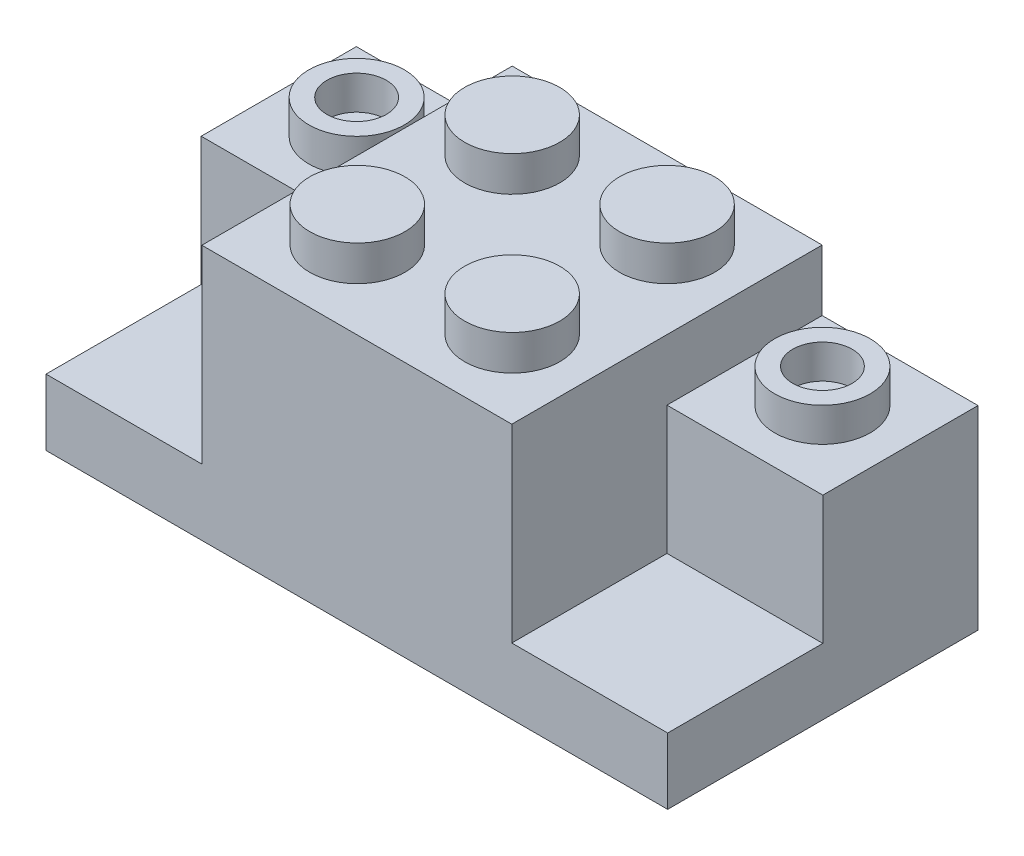
ISO-10303-21;
HEADER;
FILE_DESCRIPTION(('STEP AP214'),'2;1');
FILE_NAME('part.step','',(''),(''),'','','');
FILE_SCHEMA(('AUTOMOTIVE_DESIGN { 1 0 10303 214 1 1 1 1 }'));
ENDSEC;
DATA;
#1=APPLICATION_CONTEXT('core data for automotive mechanical design processes');
#2=APPLICATION_PROTOCOL_DEFINITION('international standard','automotive_design',2000,#1);
#3=PRODUCT_CONTEXT('',#1,'mechanical');
#4=PRODUCT('Part','Part','',(#3));
#5=PRODUCT_RELATED_PRODUCT_CATEGORY('part','',(#4));
#6=PRODUCT_DEFINITION_FORMATION('','',#4);
#7=PRODUCT_DEFINITION_CONTEXT('part definition',#1,'design');
#8=PRODUCT_DEFINITION('design','',#6,#7);
#9=PRODUCT_DEFINITION_SHAPE('','',#8);
#10=(LENGTH_UNIT() NAMED_UNIT(*) SI_UNIT(.MILLI.,.METRE.));
#11=(NAMED_UNIT(*) PLANE_ANGLE_UNIT() SI_UNIT($,.RADIAN.));
#12=(NAMED_UNIT(*) SI_UNIT($,.STERADIAN.) SOLID_ANGLE_UNIT());
#13=UNCERTAINTY_MEASURE_WITH_UNIT(LENGTH_MEASURE(1.E-05),#10,'distance_accuracy_value','');
#14=(GEOMETRIC_REPRESENTATION_CONTEXT(3) GLOBAL_UNCERTAINTY_ASSIGNED_CONTEXT((#13)) GLOBAL_UNIT_ASSIGNED_CONTEXT((#10,
#11,#12)) REPRESENTATION_CONTEXT('',''));
#15=CARTESIAN_POINT('',(0.,0.,0.));
#16=DIRECTION('',(0.,0.,1.));
#17=DIRECTION('',(1.,0.,0.));
#18=AXIS2_PLACEMENT_3D('',#15,#16,#17);
#19=CARTESIAN_POINT('',(7.965,9.74,-15.95));
#20=DIRECTION('',(1.,0.,0.));
#21=DIRECTION('',(0.,0.,-1.));
#22=AXIS2_PLACEMENT_3D('',#19,#20,#21);
#23=PLANE('',#22);
#24=DIRECTION('',(0.,0.,1.));
#25=VECTOR('',#24,1.);
#26=CARTESIAN_POINT('',(7.965,0.,-15.95));
#27=LINE('',#26,#25);
#28=CARTESIAN_POINT('',(7.965,0.,-7.975));
#29=VERTEX_POINT('',#28);
#30=CARTESIAN_POINT('',(7.965,0.,0.));
#31=VERTEX_POINT('',#30);
#32=EDGE_CURVE('E239',#29,#31,#27,.T.);
#33=ORIENTED_EDGE('',*,*,#32,.F.);
#34=DIRECTION('',(0.,-1.,0.));
#35=VECTOR('',#34,1.);
#36=CARTESIAN_POINT('',(7.965,21.0431289915669,-7.975));
#37=LINE('',#36,#35);
#38=CARTESIAN_POINT('',(7.965,6.6,-7.975));
#39=VERTEX_POINT('',#38);
#40=EDGE_CURVE('E50',#39,#29,#37,.T.);
#41=ORIENTED_EDGE('',*,*,#40,.F.);
#42=DIRECTION('',(0.,0.,1.));
#43=VECTOR('',#42,1.);
#44=CARTESIAN_POINT('',(7.965,6.6,-15.95));
#45=LINE('',#44,#43);
#46=CARTESIAN_POINT('',(7.965,6.6,-15.95));
#47=VERTEX_POINT('',#46);
#48=EDGE_CURVE('E143',#47,#39,#45,.T.);
#49=ORIENTED_EDGE('',*,*,#48,.F.);
#50=DIRECTION('',(0.,1.,0.));
#51=VECTOR('',#50,1.);
#52=CARTESIAN_POINT('',(7.965,9.74,-15.95));
#53=LINE('',#52,#51);
#54=CARTESIAN_POINT('',(7.965,9.74,-15.95));
#55=VERTEX_POINT('',#54);
#56=EDGE_CURVE('E207',#47,#55,#53,.T.);
#57=ORIENTED_EDGE('',*,*,#56,.T.);
#58=DIRECTION('',(0.,0.,1.));
#59=VECTOR('',#58,1.);
#60=CARTESIAN_POINT('',(7.965,9.74,-15.95));
#61=LINE('',#60,#59);
#62=CARTESIAN_POINT('',(7.965,9.74,0.));
#63=VERTEX_POINT('',#62);
#64=EDGE_CURVE('E237',#55,#63,#61,.T.);
#65=ORIENTED_EDGE('',*,*,#64,.T.);
#66=DIRECTION('',(0.,1.,0.));
#67=VECTOR('',#66,1.);
#68=CARTESIAN_POINT('',(7.965,9.74,0.));
#69=LINE('',#68,#67);
#70=EDGE_CURVE('E230',#31,#63,#69,.T.);
#71=ORIENTED_EDGE('',*,*,#70,.F.);
#72=EDGE_LOOP('',(#33,#41,#49,#57,#65,#71));
#73=FACE_BOUND('',#72,.T.);
#74=ADVANCED_FACE('F35',(#73),#23,.T.);
#75=CARTESIAN_POINT('',(7.965,0.,-15.95));
#76=DIRECTION('',(0.,1.,0.));
#77=DIRECTION('',(0.,0.,1.));
#78=AXIS2_PLACEMENT_3D('',#75,#76,#77);
#79=PLANE('',#78);
#80=DIRECTION('',(0.,0.,1.));
#81=VECTOR('',#80,1.);
#82=CARTESIAN_POINT('',(15.975,0.,-15.95));
#83=LINE('',#82,#81);
#84=CARTESIAN_POINT('',(15.975,0.,-7.975));
#85=VERTEX_POINT('',#84);
#86=CARTESIAN_POINT('',(15.975,0.,0.));
#87=VERTEX_POINT('',#86);
#88=EDGE_CURVE('E241',#85,#87,#83,.T.);
#89=ORIENTED_EDGE('',*,*,#88,.F.);
#90=DIRECTION('',(1.,0.,0.));
#91=VECTOR('',#90,1.);
#92=CARTESIAN_POINT('',(15.975,0.,-7.975));
#93=LINE('',#92,#91);
#94=EDGE_CURVE('E58',#29,#85,#93,.T.);
#95=ORIENTED_EDGE('',*,*,#94,.F.);
#96=ORIENTED_EDGE('',*,*,#32,.T.);
#97=DIRECTION('',(-1.,0.,0.));
#98=VECTOR('',#97,1.);
#99=CARTESIAN_POINT('',(7.965,0.,0.));
#100=LINE('',#99,#98);
#101=EDGE_CURVE('E227',#87,#31,#100,.T.);
#102=ORIENTED_EDGE('',*,*,#101,.F.);
#103=EDGE_LOOP('',(#89,#95,#96,#102));
#104=FACE_BOUND('',#103,.T.);
#105=ADVANCED_FACE('F276',(#104),#79,.T.);
#106=CARTESIAN_POINT('',(-7.965,0.,-15.95));
#107=DIRECTION('',(-1.,0.,0.));
#108=DIRECTION('',(0.,0.,1.));
#109=AXIS2_PLACEMENT_3D('',#106,#107,#108);
#110=PLANE('',#109);
#111=DIRECTION('',(0.,0.,-1.));
#112=VECTOR('',#111,1.);
#113=CARTESIAN_POINT('',(-7.965,6.6,-15.95));
#114=LINE('',#113,#112);
#115=CARTESIAN_POINT('',(-7.965,6.6,-7.975));
#116=VERTEX_POINT('',#115);
#117=CARTESIAN_POINT('',(-7.965,6.6,-15.95));
#118=VERTEX_POINT('',#117);
#119=EDGE_CURVE('E159',#116,#118,#114,.T.);
#120=ORIENTED_EDGE('',*,*,#119,.F.);
#121=DIRECTION('',(0.,-1.,0.));
#122=VECTOR('',#121,1.);
#123=CARTESIAN_POINT('',(-7.965,21.0431289915669,-7.975));
#124=LINE('',#123,#122);
#125=CARTESIAN_POINT('',(-7.965,0.,-7.975));
#126=VERTEX_POINT('',#125);
#127=EDGE_CURVE('E158',#116,#126,#124,.T.);
#128=ORIENTED_EDGE('',*,*,#127,.T.);
#129=DIRECTION('',(0.,0.,1.));
#130=VECTOR('',#129,1.);
#131=CARTESIAN_POINT('',(-7.965,0.,-15.95));
#132=LINE('',#131,#130);
#133=CARTESIAN_POINT('',(-7.965,0.,0.));
#134=VERTEX_POINT('',#133);
#135=EDGE_CURVE('E212',#126,#134,#132,.T.);
#136=ORIENTED_EDGE('',*,*,#135,.T.);
#137=DIRECTION('',(0.,-1.,0.));
#138=VECTOR('',#137,1.);
#139=CARTESIAN_POINT('',(-7.965,0.,0.));
#140=LINE('',#139,#138);
#141=CARTESIAN_POINT('',(-7.965,9.74,0.));
#142=VERTEX_POINT('',#141);
#143=EDGE_CURVE('E194',#142,#134,#140,.T.);
#144=ORIENTED_EDGE('',*,*,#143,.F.);
#145=DIRECTION('',(0.,0.,1.));
#146=VECTOR('',#145,1.);
#147=CARTESIAN_POINT('',(-7.965,9.74,-15.95));
#148=LINE('',#147,#146);
#149=CARTESIAN_POINT('',(-7.965,9.74,-15.95));
#150=VERTEX_POINT('',#149);
#151=EDGE_CURVE('E235',#150,#142,#148,.T.);
#152=ORIENTED_EDGE('',*,*,#151,.F.);
#153=DIRECTION('',(0.,-1.,0.));
#154=VECTOR('',#153,1.);
#155=CARTESIAN_POINT('',(-7.965,0.,-15.95));
#156=LINE('',#155,#154);
#157=EDGE_CURVE('E197',#150,#118,#156,.T.);
#158=ORIENTED_EDGE('',*,*,#157,.T.);
#159=EDGE_LOOP('',(#120,#128,#136,#144,#152,#158));
#160=FACE_BOUND('',#159,.T.);
#161=ADVANCED_FACE('F37',(#160),#110,.T.);
#162=CARTESIAN_POINT('',(-15.975,0.,-15.95));
#163=DIRECTION('',(0.,1.,0.));
#164=DIRECTION('',(0.,0.,1.));
#165=AXIS2_PLACEMENT_3D('',#162,#163,#164);
#166=PLANE('',#165);
#167=ORIENTED_EDGE('',*,*,#135,.F.);
#168=DIRECTION('',(1.,0.,0.));
#169=VECTOR('',#168,1.);
#170=CARTESIAN_POINT('',(-15.975,0.,-7.975));
#171=LINE('',#170,#169);
#172=CARTESIAN_POINT('',(-15.975,0.,-7.975));
#173=VERTEX_POINT('',#172);
#174=EDGE_CURVE('E147',#173,#126,#171,.T.);
#175=ORIENTED_EDGE('',*,*,#174,.F.);
#176=DIRECTION('',(0.,0.,1.));
#177=VECTOR('',#176,1.);
#178=CARTESIAN_POINT('',(-15.975,0.,-15.95));
#179=LINE('',#178,#177);
#180=CARTESIAN_POINT('',(-15.975,0.,0.));
#181=VERTEX_POINT('',#180);
#182=EDGE_CURVE('E247',#173,#181,#179,.T.);
#183=ORIENTED_EDGE('',*,*,#182,.T.);
#184=DIRECTION('',(-1.,0.,0.));
#185=VECTOR('',#184,1.);
#186=CARTESIAN_POINT('',(-15.975,0.,0.));
#187=LINE('',#186,#185);
#188=EDGE_CURVE('E215',#134,#181,#187,.T.);
#189=ORIENTED_EDGE('',*,*,#188,.F.);
#190=EDGE_LOOP('',(#167,#175,#183,#189));
#191=FACE_BOUND('',#190,.T.);
#192=ADVANCED_FACE('F296',(#191),#166,.T.);
#193=CARTESIAN_POINT('',(-7.965,9.74,-15.95));
#194=DIRECTION('',(0.,1.,0.));
#195=DIRECTION('',(0.,0.,1.));
#196=AXIS2_PLACEMENT_3D('',#193,#194,#195);
#197=PLANE('',#196);
#198=CARTESIAN_POINT('',(-3.985,9.74,-4.01));
#199=DIRECTION('',(0.,1.,0.));
#200=DIRECTION('',(0.,0.,1.));
#201=AXIS2_PLACEMENT_3D('',#198,#199,#200);
#202=CIRCLE('',#201,2.445);
#203=CARTESIAN_POINT('',(-3.985,9.74,-1.565));
#204=VERTEX_POINT('',#203);
#205=EDGE_CURVE('E162',#204,#204,#202,.T.);
#206=ORIENTED_EDGE('',*,*,#205,.F.);
#207=EDGE_LOOP('',(#206));
#208=FACE_BOUND('',#207,.T.);
#209=CARTESIAN_POINT('',(3.975,9.74,-4.01));
#210=DIRECTION('',(0.,1.,0.));
#211=DIRECTION('',(0.,0.,1.));
#212=AXIS2_PLACEMENT_3D('',#209,#210,#211);
#213=CIRCLE('',#212,2.445);
#214=CARTESIAN_POINT('',(3.975,9.74,-1.565));
#215=VERTEX_POINT('',#214);
#216=EDGE_CURVE('E176',#215,#215,#213,.T.);
#217=ORIENTED_EDGE('',*,*,#216,.F.);
#218=EDGE_LOOP('',(#217));
#219=FACE_BOUND('',#218,.T.);
#220=CARTESIAN_POINT('',(3.975,9.74,-11.97));
#221=DIRECTION('',(0.,1.,0.));
#222=DIRECTION('',(0.,0.,1.));
#223=AXIS2_PLACEMENT_3D('',#220,#221,#222);
#224=CIRCLE('',#223,2.445);
#225=CARTESIAN_POINT('',(3.975,9.74,-9.525));
#226=VERTEX_POINT('',#225);
#227=EDGE_CURVE('E182',#226,#226,#224,.T.);
#228=ORIENTED_EDGE('',*,*,#227,.F.);
#229=EDGE_LOOP('',(#228));
#230=FACE_BOUND('',#229,.T.);
#231=CARTESIAN_POINT('',(-3.985,9.74,-11.97));
#232=DIRECTION('',(0.,1.,0.));
#233=DIRECTION('',(0.,0.,1.));
#234=AXIS2_PLACEMENT_3D('',#231,#232,#233);
#235=CIRCLE('',#234,2.445);
#236=CARTESIAN_POINT('',(-3.985,9.74,-9.525));
#237=VERTEX_POINT('',#236);
#238=EDGE_CURVE('E188',#237,#237,#235,.T.);
#239=ORIENTED_EDGE('',*,*,#238,.F.);
#240=EDGE_LOOP('',(#239));
#241=FACE_BOUND('',#240,.T.);
#242=DIRECTION('',(-1.,0.,0.));
#243=VECTOR('',#242,1.);
#244=CARTESIAN_POINT('',(-7.965,9.74,0.));
#245=LINE('',#244,#243);
#246=EDGE_CURVE('E200',#63,#142,#245,.T.);
#247=ORIENTED_EDGE('',*,*,#246,.F.);
#248=ORIENTED_EDGE('',*,*,#64,.F.);
#249=DIRECTION('',(-1.,0.,0.));
#250=VECTOR('',#249,1.);
#251=CARTESIAN_POINT('',(-7.965,9.74,-15.95));
#252=LINE('',#251,#250);
#253=EDGE_CURVE('E209',#55,#150,#252,.T.);
#254=ORIENTED_EDGE('',*,*,#253,.T.);
#255=ORIENTED_EDGE('',*,*,#151,.T.);
#256=EDGE_LOOP('',(#247,#248,#254,#255));
#257=FACE_BOUND('',#256,.T.);
#258=ADVANCED_FACE('F283',(#208,#219,#230,#241,#257),#197,.T.);
#259=CARTESIAN_POINT('',(15.975,0.,-15.95));
#260=DIRECTION('',(1.,0.,0.));
#261=DIRECTION('',(0.,0.,-1.));
#262=AXIS2_PLACEMENT_3D('',#259,#260,#261);
#263=PLANE('',#262);
#264=DIRECTION('',(0.,1.,0.));
#265=VECTOR('',#264,1.);
#266=CARTESIAN_POINT('',(15.975,0.,0.));
#267=LINE('',#266,#265);
#268=CARTESIAN_POINT('',(15.975,-3.4,0.));
#269=VERTEX_POINT('',#268);
#270=EDGE_CURVE('E224',#269,#87,#267,.T.);
#271=ORIENTED_EDGE('',*,*,#270,.F.);
#272=DIRECTION('',(0.,0.,1.));
#273=VECTOR('',#272,1.);
#274=CARTESIAN_POINT('',(15.975,-3.4,-15.95));
#275=LINE('',#274,#273);
#276=CARTESIAN_POINT('',(15.975,-3.4,-15.95));
#277=VERTEX_POINT('',#276);
#278=EDGE_CURVE('E243',#277,#269,#275,.T.);
#279=ORIENTED_EDGE('',*,*,#278,.F.);
#280=DIRECTION('',(0.,1.,0.));
#281=VECTOR('',#280,1.);
#282=CARTESIAN_POINT('',(15.975,0.,-15.95));
#283=LINE('',#282,#281);
#284=CARTESIAN_POINT('',(15.975,6.6,-15.95));
#285=VERTEX_POINT('',#284);
#286=EDGE_CURVE('E136',#277,#285,#283,.T.);
#287=ORIENTED_EDGE('',*,*,#286,.T.);
#288=DIRECTION('',(0.,0.,-1.));
#289=VECTOR('',#288,1.);
#290=CARTESIAN_POINT('',(15.975,6.6,-15.95));
#291=LINE('',#290,#289);
#292=CARTESIAN_POINT('',(15.975,6.6,-7.975));
#293=VERTEX_POINT('',#292);
#294=EDGE_CURVE('E130',#293,#285,#291,.T.);
#295=ORIENTED_EDGE('',*,*,#294,.F.);
#296=DIRECTION('',(0.,-1.,0.));
#297=VECTOR('',#296,1.);
#298=CARTESIAN_POINT('',(15.975,21.0431289915669,-7.975));
#299=LINE('',#298,#297);
#300=EDGE_CURVE('E123',#293,#85,#299,.T.);
#301=ORIENTED_EDGE('',*,*,#300,.T.);
#302=ORIENTED_EDGE('',*,*,#88,.T.);
#303=EDGE_LOOP('',(#271,#279,#287,#295,#301,#302));
#304=FACE_BOUND('',#303,.T.);
#305=ADVANCED_FACE('F134',(#304),#263,.T.);
#306=CARTESIAN_POINT('',(15.975,-3.4,-15.95));
#307=DIRECTION('',(0.,-1.,0.));
#308=DIRECTION('',(0.,0.,-1.));
#309=AXIS2_PLACEMENT_3D('',#306,#307,#308);
#310=PLANE('',#309);
#311=DIRECTION('',(1.,0.,0.));
#312=VECTOR('',#311,1.);
#313=CARTESIAN_POINT('',(15.975,-3.4,0.));
#314=LINE('',#313,#312);
#315=CARTESIAN_POINT('',(-15.975,-3.4,0.));
#316=VERTEX_POINT('',#315);
#317=EDGE_CURVE('E221',#316,#269,#314,.T.);
#318=ORIENTED_EDGE('',*,*,#317,.F.);
#319=DIRECTION('',(0.,0.,1.));
#320=VECTOR('',#319,1.);
#321=CARTESIAN_POINT('',(-15.975,-3.4,-15.95));
#322=LINE('',#321,#320);
#323=CARTESIAN_POINT('',(-15.975,-3.4,-15.95));
#324=VERTEX_POINT('',#323);
#325=EDGE_CURVE('E245',#324,#316,#322,.T.);
#326=ORIENTED_EDGE('',*,*,#325,.F.);
#327=DIRECTION('',(1.,0.,0.));
#328=VECTOR('',#327,1.);
#329=CARTESIAN_POINT('',(15.975,-3.4,-15.95));
#330=LINE('',#329,#328);
#331=EDGE_CURVE('E203',#324,#277,#330,.T.);
#332=ORIENTED_EDGE('',*,*,#331,.T.);
#333=ORIENTED_EDGE('',*,*,#278,.T.);
#334=EDGE_LOOP('',(#318,#326,#332,#333));
#335=FACE_BOUND('',#334,.T.);
#336=ADVANCED_FACE('F288',(#335),#310,.T.);
#337=CARTESIAN_POINT('',(-15.975,-3.4,-15.95));
#338=DIRECTION('',(-1.,0.,0.));
#339=DIRECTION('',(0.,0.,1.));
#340=AXIS2_PLACEMENT_3D('',#337,#338,#339);
#341=PLANE('',#340);
#342=DIRECTION('',(0.,-1.,0.));
#343=VECTOR('',#342,1.);
#344=CARTESIAN_POINT('',(-15.975,-3.4,0.));
#345=LINE('',#344,#343);
#346=EDGE_CURVE('E218',#181,#316,#345,.T.);
#347=ORIENTED_EDGE('',*,*,#346,.F.);
#348=ORIENTED_EDGE('',*,*,#182,.F.);
#349=DIRECTION('',(0.,-1.,0.));
#350=VECTOR('',#349,1.);
#351=CARTESIAN_POINT('',(-15.975,21.0431289915669,-7.975));
#352=LINE('',#351,#350);
#353=CARTESIAN_POINT('',(-15.975,6.6,-7.975));
#354=VERTEX_POINT('',#353);
#355=EDGE_CURVE('E144',#354,#173,#352,.T.);
#356=ORIENTED_EDGE('',*,*,#355,.F.);
#357=DIRECTION('',(0.,0.,1.));
#358=VECTOR('',#357,1.);
#359=CARTESIAN_POINT('',(-15.975,6.6,-15.95));
#360=LINE('',#359,#358);
#361=CARTESIAN_POINT('',(-15.975,6.6,-15.95));
#362=VERTEX_POINT('',#361);
#363=EDGE_CURVE('E166',#362,#354,#360,.T.);
#364=ORIENTED_EDGE('',*,*,#363,.F.);
#365=DIRECTION('',(0.,-1.,0.));
#366=VECTOR('',#365,1.);
#367=CARTESIAN_POINT('',(-15.975,-3.4,-15.95));
#368=LINE('',#367,#366);
#369=EDGE_CURVE('E199',#362,#324,#368,.T.);
#370=ORIENTED_EDGE('',*,*,#369,.T.);
#371=ORIENTED_EDGE('',*,*,#325,.T.);
#372=EDGE_LOOP('',(#347,#348,#356,#364,#370,#371));
#373=FACE_BOUND('',#372,.T.);
#374=ADVANCED_FACE('F291',(#373),#341,.T.);
#375=CARTESIAN_POINT('',(0.,0.,-15.95));
#376=DIRECTION('',(0.,0.,-1.));
#377=DIRECTION('',(-1.,0.,0.));
#378=AXIS2_PLACEMENT_3D('',#375,#376,#377);
#379=PLANE('',#378);
#380=ORIENTED_EDGE('',*,*,#56,.F.);
#381=DIRECTION('',(-1.,0.,0.));
#382=VECTOR('',#381,1.);
#383=CARTESIAN_POINT('',(15.975,6.6,-15.95));
#384=LINE('',#383,#382);
#385=EDGE_CURVE('E140',#285,#47,#384,.T.);
#386=ORIENTED_EDGE('',*,*,#385,.F.);
#387=ORIENTED_EDGE('',*,*,#286,.F.);
#388=ORIENTED_EDGE('',*,*,#331,.F.);
#389=ORIENTED_EDGE('',*,*,#369,.F.);
#390=DIRECTION('',(-1.,0.,0.));
#391=VECTOR('',#390,1.);
#392=CARTESIAN_POINT('',(-15.975,6.6,-15.95));
#393=LINE('',#392,#391);
#394=EDGE_CURVE('E169',#118,#362,#393,.T.);
#395=ORIENTED_EDGE('',*,*,#394,.F.);
#396=ORIENTED_EDGE('',*,*,#157,.F.);
#397=ORIENTED_EDGE('',*,*,#253,.F.);
#398=EDGE_LOOP('',(#380,#386,#387,#388,#389,#395,#396,#397));
#399=FACE_BOUND('',#398,.T.);
#400=ADVANCED_FACE('F294',(#399),#379,.T.);
#401=CARTESIAN_POINT('',(0.,0.,0.));
#402=DIRECTION('',(0.,0.,-1.));
#403=DIRECTION('',(-1.,0.,0.));
#404=AXIS2_PLACEMENT_3D('',#401,#402,#403);
#405=PLANE('',#404);
#406=ORIENTED_EDGE('',*,*,#143,.T.);
#407=ORIENTED_EDGE('',*,*,#188,.T.);
#408=ORIENTED_EDGE('',*,*,#346,.T.);
#409=ORIENTED_EDGE('',*,*,#317,.T.);
#410=ORIENTED_EDGE('',*,*,#270,.T.);
#411=ORIENTED_EDGE('',*,*,#101,.T.);
#412=ORIENTED_EDGE('',*,*,#70,.T.);
#413=ORIENTED_EDGE('',*,*,#246,.T.);
#414=EDGE_LOOP('',(#406,#407,#408,#409,#410,#411,#412,#413));
#415=FACE_BOUND('',#414,.T.);
#416=ADVANCED_FACE('F325',(#415),#405,.F.);
#417=CARTESIAN_POINT('',(-3.985,11.55,-11.97));
#418=DIRECTION('',(0.,-1.,0.));
#419=DIRECTION('',(0.,0.,-1.));
#420=AXIS2_PLACEMENT_3D('',#417,#418,#419);
#421=CYLINDRICAL_SURFACE('',#420,2.445);
#422=CARTESIAN_POINT('',(-3.985,11.55,-11.97));
#423=DIRECTION('',(0.,1.,0.));
#424=DIRECTION('',(0.,0.,1.));
#425=AXIS2_PLACEMENT_3D('',#422,#423,#424);
#426=CIRCLE('',#425,2.445);
#427=CARTESIAN_POINT('',(-3.985,11.55,-9.525));
#428=VERTEX_POINT('',#427);
#429=EDGE_CURVE('E191',#428,#428,#426,.T.);
#430=ORIENTED_EDGE('',*,*,#429,.F.);
#431=EDGE_LOOP('',(#430));
#432=FACE_BOUND('',#431,.T.);
#433=ORIENTED_EDGE('',*,*,#238,.T.);
#434=EDGE_LOOP('',(#433));
#435=FACE_BOUND('',#434,.T.);
#436=ADVANCED_FACE('F332',(#432,#435),#421,.T.);
#437=CARTESIAN_POINT('',(-3.985,11.55,-11.97));
#438=DIRECTION('',(0.,1.,0.));
#439=DIRECTION('',(0.,0.,1.));
#440=AXIS2_PLACEMENT_3D('',#437,#438,#439);
#441=PLANE('',#440);
#442=ORIENTED_EDGE('',*,*,#429,.T.);
#443=EDGE_LOOP('',(#442));
#444=FACE_BOUND('',#443,.T.);
#445=ADVANCED_FACE('F337',(#444),#441,.T.);
#446=CARTESIAN_POINT('',(3.975,11.55,-11.97));
#447=DIRECTION('',(0.,-1.,0.));
#448=DIRECTION('',(0.,0.,-1.));
#449=AXIS2_PLACEMENT_3D('',#446,#447,#448);
#450=CYLINDRICAL_SURFACE('',#449,2.445);
#451=CARTESIAN_POINT('',(3.975,11.55,-11.97));
#452=DIRECTION('',(0.,1.,0.));
#453=DIRECTION('',(0.,0.,1.));
#454=AXIS2_PLACEMENT_3D('',#451,#452,#453);
#455=CIRCLE('',#454,2.445);
#456=CARTESIAN_POINT('',(3.975,11.55,-9.525));
#457=VERTEX_POINT('',#456);
#458=EDGE_CURVE('E185',#457,#457,#455,.T.);
#459=ORIENTED_EDGE('',*,*,#458,.F.);
#460=EDGE_LOOP('',(#459));
#461=FACE_BOUND('',#460,.T.);
#462=ORIENTED_EDGE('',*,*,#227,.T.);
#463=EDGE_LOOP('',(#462));
#464=FACE_BOUND('',#463,.T.);
#465=ADVANCED_FACE('F344',(#461,#464),#450,.T.);
#466=CARTESIAN_POINT('',(3.975,11.55,-11.97));
#467=DIRECTION('',(0.,1.,0.));
#468=DIRECTION('',(0.,0.,1.));
#469=AXIS2_PLACEMENT_3D('',#466,#467,#468);
#470=PLANE('',#469);
#471=ORIENTED_EDGE('',*,*,#458,.T.);
#472=EDGE_LOOP('',(#471));
#473=FACE_BOUND('',#472,.T.);
#474=ADVANCED_FACE('F348',(#473),#470,.T.);
#475=CARTESIAN_POINT('',(3.975,11.55,-4.01));
#476=DIRECTION('',(0.,-1.,0.));
#477=DIRECTION('',(0.,0.,-1.));
#478=AXIS2_PLACEMENT_3D('',#475,#476,#477);
#479=CYLINDRICAL_SURFACE('',#478,2.445);
#480=CARTESIAN_POINT('',(3.975,11.55,-4.01));
#481=DIRECTION('',(0.,1.,0.));
#482=DIRECTION('',(0.,0.,1.));
#483=AXIS2_PLACEMENT_3D('',#480,#481,#482);
#484=CIRCLE('',#483,2.445);
#485=CARTESIAN_POINT('',(3.975,11.55,-1.565));
#486=VERTEX_POINT('',#485);
#487=EDGE_CURVE('E179',#486,#486,#484,.T.);
#488=ORIENTED_EDGE('',*,*,#487,.F.);
#489=EDGE_LOOP('',(#488));
#490=FACE_BOUND('',#489,.T.);
#491=ORIENTED_EDGE('',*,*,#216,.T.);
#492=EDGE_LOOP('',(#491));
#493=FACE_BOUND('',#492,.T.);
#494=ADVANCED_FACE('F352',(#490,#493),#479,.T.);
#495=CARTESIAN_POINT('',(3.975,11.55,-4.01));
#496=DIRECTION('',(0.,1.,0.));
#497=DIRECTION('',(0.,0.,1.));
#498=AXIS2_PLACEMENT_3D('',#495,#496,#497);
#499=PLANE('',#498);
#500=ORIENTED_EDGE('',*,*,#487,.T.);
#501=EDGE_LOOP('',(#500));
#502=FACE_BOUND('',#501,.T.);
#503=ADVANCED_FACE('F356',(#502),#499,.T.);
#504=CARTESIAN_POINT('',(-3.985,11.55,-4.01));
#505=DIRECTION('',(0.,-1.,0.));
#506=DIRECTION('',(0.,0.,-1.));
#507=AXIS2_PLACEMENT_3D('',#504,#505,#506);
#508=CYLINDRICAL_SURFACE('',#507,2.445);
#509=CARTESIAN_POINT('',(-3.985,11.55,-4.01));
#510=DIRECTION('',(0.,1.,0.));
#511=DIRECTION('',(0.,0.,1.));
#512=AXIS2_PLACEMENT_3D('',#509,#510,#511);
#513=CIRCLE('',#512,2.445);
#514=CARTESIAN_POINT('',(-3.985,11.55,-1.565));
#515=VERTEX_POINT('',#514);
#516=EDGE_CURVE('E173',#515,#515,#513,.T.);
#517=ORIENTED_EDGE('',*,*,#516,.F.);
#518=EDGE_LOOP('',(#517));
#519=FACE_BOUND('',#518,.T.);
#520=ORIENTED_EDGE('',*,*,#205,.T.);
#521=EDGE_LOOP('',(#520));
#522=FACE_BOUND('',#521,.T.);
#523=ADVANCED_FACE('F360',(#519,#522),#508,.T.);
#524=CARTESIAN_POINT('',(-3.985,11.55,-4.01));
#525=DIRECTION('',(0.,1.,0.));
#526=DIRECTION('',(0.,0.,1.));
#527=AXIS2_PLACEMENT_3D('',#524,#525,#526);
#528=PLANE('',#527);
#529=ORIENTED_EDGE('',*,*,#516,.T.);
#530=EDGE_LOOP('',(#529));
#531=FACE_BOUND('',#530,.T.);
#532=ADVANCED_FACE('F364',(#531),#528,.T.);
#533=CARTESIAN_POINT('',(-15.975,21.0431289915669,-7.975));
#534=DIRECTION('',(0.,0.,-1.));
#535=DIRECTION('',(-1.,0.,0.));
#536=AXIS2_PLACEMENT_3D('',#533,#534,#535);
#537=PLANE('',#536);
#538=DIRECTION('',(1.,0.,0.));
#539=VECTOR('',#538,1.);
#540=CARTESIAN_POINT('',(-15.975,6.6,-7.975));
#541=LINE('',#540,#539);
#542=EDGE_CURVE('E163',#354,#116,#541,.T.);
#543=ORIENTED_EDGE('',*,*,#542,.F.);
#544=ORIENTED_EDGE('',*,*,#355,.T.);
#545=ORIENTED_EDGE('',*,*,#174,.T.);
#546=ORIENTED_EDGE('',*,*,#127,.F.);
#547=EDGE_LOOP('',(#543,#544,#545,#546));
#548=FACE_BOUND('',#547,.T.);
#549=ADVANCED_FACE('F311',(#548),#537,.F.);
#550=CARTESIAN_POINT('',(-7.965,6.6,-15.95));
#551=DIRECTION('',(0.,1.,0.));
#552=DIRECTION('',(0.,0.,1.));
#553=AXIS2_PLACEMENT_3D('',#550,#551,#552);
#554=PLANE('',#553);
#555=CARTESIAN_POINT('',(-11.97,6.6,-11.96));
#556=DIRECTION('',(0.,1.,0.));
#557=DIRECTION('',(0.,0.,-1.));
#558=AXIS2_PLACEMENT_3D('',#555,#556,#557);
#559=CIRCLE('',#558,2.455);
#560=CARTESIAN_POINT('',(-11.97,6.6,-14.415));
#561=VERTEX_POINT('',#560);
#562=EDGE_CURVE('E462',#561,#561,#559,.T.);
#563=ORIENTED_EDGE('',*,*,#562,.F.);
#564=EDGE_LOOP('',(#563));
#565=FACE_BOUND('',#564,.T.);
#566=ORIENTED_EDGE('',*,*,#394,.T.);
#567=ORIENTED_EDGE('',*,*,#363,.T.);
#568=ORIENTED_EDGE('',*,*,#542,.T.);
#569=ORIENTED_EDGE('',*,*,#119,.T.);
#570=EDGE_LOOP('',(#566,#567,#568,#569));
#571=FACE_BOUND('',#570,.T.);
#572=ADVANCED_FACE('F316',(#565,#571),#554,.T.);
#573=CARTESIAN_POINT('',(15.975,21.0431289915669,-7.975));
#574=DIRECTION('',(0.,0.,-1.));
#575=DIRECTION('',(-1.,0.,0.));
#576=AXIS2_PLACEMENT_3D('',#573,#574,#575);
#577=PLANE('',#576);
#578=DIRECTION('',(1.,0.,0.));
#579=VECTOR('',#578,1.);
#580=CARTESIAN_POINT('',(15.975,6.6,-7.975));
#581=LINE('',#580,#579);
#582=EDGE_CURVE('E127',#39,#293,#581,.T.);
#583=ORIENTED_EDGE('',*,*,#582,.F.);
#584=ORIENTED_EDGE('',*,*,#40,.T.);
#585=ORIENTED_EDGE('',*,*,#94,.T.);
#586=ORIENTED_EDGE('',*,*,#300,.F.);
#587=EDGE_LOOP('',(#583,#584,#585,#586));
#588=FACE_BOUND('',#587,.T.);
#589=ADVANCED_FACE('F125',(#588),#577,.F.);
#590=CARTESIAN_POINT('',(-7.965,6.6,-15.95));
#591=DIRECTION('',(0.,1.,0.));
#592=DIRECTION('',(0.,0.,1.));
#593=AXIS2_PLACEMENT_3D('',#590,#591,#592);
#594=PLANE('',#593);
#595=CARTESIAN_POINT('',(11.97,6.6,-11.96));
#596=DIRECTION('',(0.,1.,0.));
#597=DIRECTION('',(0.,0.,1.));
#598=AXIS2_PLACEMENT_3D('',#595,#596,#597);
#599=CIRCLE('',#598,2.455);
#600=CARTESIAN_POINT('',(11.97,6.6,-9.505));
#601=VERTEX_POINT('',#600);
#602=EDGE_CURVE('E473',#601,#601,#599,.T.);
#603=ORIENTED_EDGE('',*,*,#602,.F.);
#604=EDGE_LOOP('',(#603));
#605=FACE_BOUND('',#604,.T.);
#606=ORIENTED_EDGE('',*,*,#294,.T.);
#607=ORIENTED_EDGE('',*,*,#385,.T.);
#608=ORIENTED_EDGE('',*,*,#48,.T.);
#609=ORIENTED_EDGE('',*,*,#582,.T.);
#610=EDGE_LOOP('',(#606,#607,#608,#609));
#611=FACE_BOUND('',#610,.T.);
#612=ADVANCED_FACE('F142',(#605,#611),#594,.T.);
#613=CARTESIAN_POINT('',(11.97,8.34,-11.96));
#614=DIRECTION('',(0.,1.,0.));
#615=DIRECTION('',(0.,0.,1.));
#616=AXIS2_PLACEMENT_3D('',#613,#614,#615);
#617=PLANE('',#616);
#618=CARTESIAN_POINT('',(11.97,8.34,-11.96));
#619=DIRECTION('',(0.,1.,0.));
#620=DIRECTION('',(0.,0.,1.));
#621=AXIS2_PLACEMENT_3D('',#618,#619,#620);
#622=CIRCLE('',#621,2.455);
#623=CARTESIAN_POINT('',(11.97,8.34,-9.505));
#624=VERTEX_POINT('',#623);
#625=EDGE_CURVE('E154',#624,#624,#622,.T.);
#626=ORIENTED_EDGE('',*,*,#625,.T.);
#627=EDGE_LOOP('',(#626));
#628=FACE_BOUND('',#627,.T.);
#629=CARTESIAN_POINT('',(11.97,8.34,-11.96));
#630=DIRECTION('',(0.,1.,0.));
#631=DIRECTION('',(0.,0.,1.));
#632=AXIS2_PLACEMENT_3D('',#629,#630,#631);
#633=CIRCLE('',#632,1.525);
#634=CARTESIAN_POINT('',(11.97,8.34,-10.435));
#635=VERTEX_POINT('',#634);
#636=EDGE_CURVE('E469',#635,#635,#633,.T.);
#637=ORIENTED_EDGE('',*,*,#636,.F.);
#638=EDGE_LOOP('',(#637));
#639=FACE_BOUND('',#638,.T.);
#640=ADVANCED_FACE('F273',(#628,#639),#617,.T.);
#641=CARTESIAN_POINT('',(11.97,8.34,-11.96));
#642=DIRECTION('',(0.,-1.,0.));
#643=DIRECTION('',(0.,0.,-1.));
#644=AXIS2_PLACEMENT_3D('',#641,#642,#643);
#645=CYLINDRICAL_SURFACE('',#644,2.455);
#646=ORIENTED_EDGE('',*,*,#625,.F.);
#647=EDGE_LOOP('',(#646));
#648=FACE_BOUND('',#647,.T.);
#649=ORIENTED_EDGE('',*,*,#602,.T.);
#650=EDGE_LOOP('',(#649));
#651=FACE_BOUND('',#650,.T.);
#652=ADVANCED_FACE('F267',(#648,#651),#645,.T.);
#653=CARTESIAN_POINT('',(11.97,8.34,-11.96));
#654=DIRECTION('',(0.,-1.,0.));
#655=DIRECTION('',(0.,0.,-1.));
#656=AXIS2_PLACEMENT_3D('',#653,#654,#655);
#657=CYLINDRICAL_SURFACE('',#656,1.525);
#658=ORIENTED_EDGE('',*,*,#636,.T.);
#659=EDGE_LOOP('',(#658));
#660=FACE_BOUND('',#659,.T.);
#661=CARTESIAN_POINT('',(11.97,6.6,-11.96));
#662=DIRECTION('',(0.,1.,0.));
#663=DIRECTION('',(0.,0.,1.));
#664=AXIS2_PLACEMENT_3D('',#661,#662,#663);
#665=CIRCLE('',#664,1.525);
#666=CARTESIAN_POINT('',(11.97,6.6,-10.435));
#667=VERTEX_POINT('',#666);
#668=EDGE_CURVE('E43',#667,#667,#665,.F.);
#669=ORIENTED_EDGE('',*,*,#668,.T.);
#670=EDGE_LOOP('',(#669));
#671=FACE_BOUND('',#670,.T.);
#672=ADVANCED_FACE('F252',(#660,#671),#657,.F.);
#673=ORIENTED_EDGE('',*,*,#668,.F.);
#674=EDGE_LOOP('',(#673));
#675=FACE_BOUND('',#674,.T.);
#676=ADVANCED_FACE('F254',(#675),#594,.T.);
#677=CARTESIAN_POINT('',(-11.97,8.34,-11.96));
#678=DIRECTION('',(0.,-1.,0.));
#679=DIRECTION('',(0.,0.,-1.));
#680=AXIS2_PLACEMENT_3D('',#677,#678,#679);
#681=PLANE('',#680);
#682=CARTESIAN_POINT('',(-11.97,8.34,-11.96));
#683=DIRECTION('',(0.,1.,0.));
#684=DIRECTION('',(0.,0.,-1.));
#685=AXIS2_PLACEMENT_3D('',#682,#683,#684);
#686=CIRCLE('',#685,2.455);
#687=CARTESIAN_POINT('',(-11.97,8.34,-14.415));
#688=VERTEX_POINT('',#687);
#689=EDGE_CURVE('E465',#688,#688,#686,.T.);
#690=ORIENTED_EDGE('',*,*,#689,.T.);
#691=EDGE_LOOP('',(#690));
#692=FACE_BOUND('',#691,.T.);
#693=CARTESIAN_POINT('',(-11.97,8.34,-11.96));
#694=DIRECTION('',(0.,1.,0.));
#695=DIRECTION('',(0.,0.,-1.));
#696=AXIS2_PLACEMENT_3D('',#693,#694,#695);
#697=CIRCLE('',#696,1.525);
#698=CARTESIAN_POINT('',(-11.97,8.34,-13.485));
#699=VERTEX_POINT('',#698);
#700=EDGE_CURVE('E459',#699,#699,#697,.T.);
#701=ORIENTED_EDGE('',*,*,#700,.F.);
#702=EDGE_LOOP('',(#701));
#703=FACE_BOUND('',#702,.T.);
#704=ADVANCED_FACE('F256',(#692,#703),#681,.F.);
#705=CARTESIAN_POINT('',(-11.97,8.34,-11.96));
#706=DIRECTION('',(0.,-1.,0.));
#707=DIRECTION('',(0.,0.,-1.));
#708=AXIS2_PLACEMENT_3D('',#705,#706,#707);
#709=CYLINDRICAL_SURFACE('',#708,2.455);
#710=ORIENTED_EDGE('',*,*,#689,.F.);
#711=EDGE_LOOP('',(#710));
#712=FACE_BOUND('',#711,.T.);
#713=ORIENTED_EDGE('',*,*,#562,.T.);
#714=EDGE_LOOP('',(#713));
#715=FACE_BOUND('',#714,.T.);
#716=ADVANCED_FACE('F263',(#712,#715),#709,.T.);
#717=CARTESIAN_POINT('',(-11.97,8.34,-11.96));
#718=DIRECTION('',(0.,-1.,0.));
#719=DIRECTION('',(0.,0.,-1.));
#720=AXIS2_PLACEMENT_3D('',#717,#718,#719);
#721=CYLINDRICAL_SURFACE('',#720,1.525);
#722=ORIENTED_EDGE('',*,*,#700,.T.);
#723=EDGE_LOOP('',(#722));
#724=FACE_BOUND('',#723,.T.);
#725=CARTESIAN_POINT('',(-11.97,6.6,-11.96));
#726=DIRECTION('',(0.,1.,0.));
#727=DIRECTION('',(0.,0.,1.));
#728=AXIS2_PLACEMENT_3D('',#725,#726,#727);
#729=CIRCLE('',#728,1.525);
#730=CARTESIAN_POINT('',(-11.97,6.6,-10.435));
#731=VERTEX_POINT('',#730);
#732=EDGE_CURVE('E12',#731,#731,#729,.F.);
#733=ORIENTED_EDGE('',*,*,#732,.T.);
#734=EDGE_LOOP('',(#733));
#735=FACE_BOUND('',#734,.T.);
#736=ADVANCED_FACE('F407',(#724,#735),#721,.F.);
#737=ORIENTED_EDGE('',*,*,#732,.F.);
#738=EDGE_LOOP('',(#737));
#739=FACE_BOUND('',#738,.T.);
#740=ADVANCED_FACE('F371',(#739),#554,.T.);
#741=CLOSED_SHELL('',(#74,#105,#161,#192,#258,#305,#336,#374,#400,#416,#436,#445,#465,#474,#494,
#503,#523,#532,#549,#572,#589,#612,#640,#652,#672,#676,#704,#716,#736,#740));
#742=MANIFOLD_SOLID_BREP('B2',#741);
#743=ADVANCED_BREP_SHAPE_REPRESENTATION('',(#18,#742),#14);
#744=SHAPE_DEFINITION_REPRESENTATION(#9,#743);
ENDSEC;
END-ISO-10303-21;
